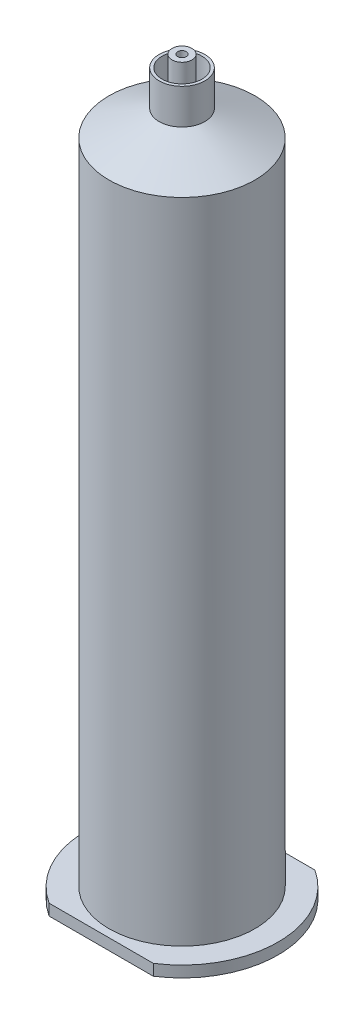
ISO-10303-21;
HEADER;
FILE_DESCRIPTION(('STEP AP214'),'2;1');
FILE_NAME('part.step','',(''),(''),'','','');
FILE_SCHEMA(('AUTOMOTIVE_DESIGN { 1 0 10303 214 1 1 1 1 }'));
ENDSEC;
DATA;
#1=APPLICATION_CONTEXT('core data for automotive mechanical design processes');
#2=APPLICATION_PROTOCOL_DEFINITION('international standard','automotive_design',2000,#1);
#3=PRODUCT_CONTEXT('',#1,'mechanical');
#4=PRODUCT('Part','Part','',(#3));
#5=PRODUCT_RELATED_PRODUCT_CATEGORY('part','',(#4));
#6=PRODUCT_DEFINITION_FORMATION('','',#4);
#7=PRODUCT_DEFINITION_CONTEXT('part definition',#1,'design');
#8=PRODUCT_DEFINITION('design','',#6,#7);
#9=PRODUCT_DEFINITION_SHAPE('','',#8);
#10=(LENGTH_UNIT() NAMED_UNIT(*) SI_UNIT(.MILLI.,.METRE.));
#11=(NAMED_UNIT(*) PLANE_ANGLE_UNIT() SI_UNIT($,.RADIAN.));
#12=(NAMED_UNIT(*) SI_UNIT($,.STERADIAN.) SOLID_ANGLE_UNIT());
#13=UNCERTAINTY_MEASURE_WITH_UNIT(LENGTH_MEASURE(1.E-05),#10,'distance_accuracy_value','');
#14=(GEOMETRIC_REPRESENTATION_CONTEXT(3) GLOBAL_UNCERTAINTY_ASSIGNED_CONTEXT((#13)) GLOBAL_UNIT_ASSIGNED_CONTEXT((#10,
#11,#12)) REPRESENTATION_CONTEXT('',''));
#15=CARTESIAN_POINT('',(0.,0.,0.));
#16=DIRECTION('',(0.,0.,1.));
#17=DIRECTION('',(1.,0.,0.));
#18=AXIS2_PLACEMENT_3D('',#15,#16,#17);
#19=CARTESIAN_POINT('',(0.,148.,0.));
#20=DIRECTION('',(0.,1.,0.));
#21=DIRECTION('',(0.,0.,1.));
#22=AXIS2_PLACEMENT_3D('',#19,#20,#21);
#23=PLANE('',#22);
#24=CARTESIAN_POINT('',(0.,148.,0.));
#25=DIRECTION('',(0.,1.,0.));
#26=DIRECTION('',(0.,0.,1.));
#27=AXIS2_PLACEMENT_3D('',#24,#25,#26);
#28=CIRCLE('',#27,4.7);
#29=CARTESIAN_POINT('',(0.,148.,-4.7));
#30=VERTEX_POINT('',#29);
#31=EDGE_CURVE('E13',#30,#30,#28,.T.);
#32=ORIENTED_EDGE('',*,*,#31,.T.);
#33=EDGE_LOOP('',(#32));
#34=FACE_BOUND('',#33,.T.);
#35=CARTESIAN_POINT('',(0.,148.,0.));
#36=DIRECTION('',(0.,1.,0.));
#37=DIRECTION('',(0.,0.,1.));
#38=AXIS2_PLACEMENT_3D('',#35,#36,#37);
#39=CIRCLE('',#38,4.1);
#40=CARTESIAN_POINT('',(0.,148.,-4.1));
#41=VERTEX_POINT('',#40);
#42=EDGE_CURVE('E69',#41,#41,#39,.T.);
#43=ORIENTED_EDGE('',*,*,#42,.F.);
#44=EDGE_LOOP('',(#43));
#45=FACE_BOUND('',#44,.T.);
#46=ADVANCED_FACE('F58',(#34,#45),#23,.T.);
#47=CARTESIAN_POINT('',(0.,140.75,0.));
#48=DIRECTION('',(0.,1.,0.));
#49=DIRECTION('',(0.,0.,1.));
#50=AXIS2_PLACEMENT_3D('',#47,#48,#49);
#51=PLANE('',#50);
#52=CARTESIAN_POINT('',(0.,140.75,0.));
#53=DIRECTION('',(0.,1.,0.));
#54=DIRECTION('',(0.,0.,1.));
#55=AXIS2_PLACEMENT_3D('',#52,#53,#54);
#56=CIRCLE('',#55,4.7);
#57=CARTESIAN_POINT('',(0.,140.75,-4.7));
#58=VERTEX_POINT('',#57);
#59=EDGE_CURVE('E62',#58,#58,#56,.T.);
#60=ORIENTED_EDGE('',*,*,#59,.F.);
#61=EDGE_LOOP('',(#60));
#62=FACE_BOUND('',#61,.T.);
#63=CARTESIAN_POINT('',(0.,140.75,0.));
#64=DIRECTION('',(0.,1.,0.));
#65=DIRECTION('',(0.,0.,1.));
#66=AXIS2_PLACEMENT_3D('',#63,#64,#65);
#67=CIRCLE('',#66,4.1);
#68=CARTESIAN_POINT('',(0.,140.75,-4.1));
#69=VERTEX_POINT('',#68);
#70=EDGE_CURVE('E71',#69,#69,#67,.T.);
#71=ORIENTED_EDGE('',*,*,#70,.T.);
#72=EDGE_LOOP('',(#71));
#73=FACE_BOUND('',#72,.T.);
#74=ADVANCED_FACE('F81',(#62,#73),#51,.F.);
#75=CARTESIAN_POINT('',(0.,148.,0.));
#76=DIRECTION('',(0.,-1.,0.));
#77=DIRECTION('',(0.,0.,-1.));
#78=AXIS2_PLACEMENT_3D('',#75,#76,#77);
#79=CYLINDRICAL_SURFACE('',#78,4.7);
#80=CARTESIAN_POINT('',(0.,148.,-4.7));
#81=CARTESIAN_POINT('',(0.,147.924479166667,-4.7));
#82=CARTESIAN_POINT('',(0.,147.848958333333,-4.7));
#83=CARTESIAN_POINT('',(0.,147.697916666667,-4.7));
#84=CARTESIAN_POINT('',(0.,147.622395833333,-4.7));
#85=CARTESIAN_POINT('',(0.,147.471354166667,-4.7));
#86=CARTESIAN_POINT('',(0.,147.395833333333,-4.7));
#87=CARTESIAN_POINT('',(0.,147.244791666667,-4.7));
#88=CARTESIAN_POINT('',(0.,147.169270833333,-4.7));
#89=CARTESIAN_POINT('',(0.,147.018229166667,-4.7));
#90=CARTESIAN_POINT('',(0.,146.942708333333,-4.7));
#91=CARTESIAN_POINT('',(0.,146.791666666667,-4.7));
#92=CARTESIAN_POINT('',(0.,146.716145833333,-4.7));
#93=CARTESIAN_POINT('',(0.,146.565104166667,-4.7));
#94=CARTESIAN_POINT('',(0.,146.489583333333,-4.7));
#95=CARTESIAN_POINT('',(0.,146.338541666667,-4.7));
#96=CARTESIAN_POINT('',(0.,146.263020833333,-4.7));
#97=CARTESIAN_POINT('',(0.,146.111979166667,-4.7));
#98=CARTESIAN_POINT('',(0.,146.036458333333,-4.7));
#99=CARTESIAN_POINT('',(0.,145.885416666667,-4.7));
#100=CARTESIAN_POINT('',(0.,145.809895833333,-4.7));
#101=CARTESIAN_POINT('',(0.,145.658854166667,-4.7));
#102=CARTESIAN_POINT('',(0.,145.583333333333,-4.7));
#103=CARTESIAN_POINT('',(0.,145.432291666667,-4.7));
#104=CARTESIAN_POINT('',(0.,145.356770833333,-4.7));
#105=CARTESIAN_POINT('',(0.,145.205729166667,-4.7));
#106=CARTESIAN_POINT('',(0.,145.130208333333,-4.7));
#107=CARTESIAN_POINT('',(0.,144.979166666667,-4.7));
#108=CARTESIAN_POINT('',(0.,144.903645833333,-4.7));
#109=CARTESIAN_POINT('',(0.,144.752604166667,-4.7));
#110=CARTESIAN_POINT('',(0.,144.677083333333,-4.7));
#111=CARTESIAN_POINT('',(0.,144.526041666667,-4.7));
#112=CARTESIAN_POINT('',(0.,144.450520833333,-4.7));
#113=CARTESIAN_POINT('',(0.,144.299479166667,-4.7));
#114=CARTESIAN_POINT('',(0.,144.223958333333,-4.7));
#115=CARTESIAN_POINT('',(0.,144.072916666667,-4.7));
#116=CARTESIAN_POINT('',(0.,143.997395833333,-4.7));
#117=CARTESIAN_POINT('',(0.,143.846354166667,-4.7));
#118=CARTESIAN_POINT('',(0.,143.770833333333,-4.7));
#119=CARTESIAN_POINT('',(0.,143.619791666667,-4.7));
#120=CARTESIAN_POINT('',(0.,143.544270833333,-4.7));
#121=CARTESIAN_POINT('',(0.,143.393229166667,-4.7));
#122=CARTESIAN_POINT('',(0.,143.317708333333,-4.7));
#123=CARTESIAN_POINT('',(0.,143.166666666667,-4.7));
#124=CARTESIAN_POINT('',(0.,143.091145833333,-4.7));
#125=CARTESIAN_POINT('',(0.,142.940104166667,-4.7));
#126=CARTESIAN_POINT('',(0.,142.864583333333,-4.7));
#127=CARTESIAN_POINT('',(0.,142.713541666667,-4.7));
#128=CARTESIAN_POINT('',(0.,142.638020833333,-4.7));
#129=CARTESIAN_POINT('',(0.,142.486979166667,-4.7));
#130=CARTESIAN_POINT('',(0.,142.411458333333,-4.7));
#131=CARTESIAN_POINT('',(0.,142.260416666667,-4.7));
#132=CARTESIAN_POINT('',(0.,142.184895833333,-4.7));
#133=CARTESIAN_POINT('',(0.,142.033854166667,-4.7));
#134=CARTESIAN_POINT('',(0.,141.958333333333,-4.7));
#135=CARTESIAN_POINT('',(0.,141.807291666667,-4.7));
#136=CARTESIAN_POINT('',(0.,141.731770833333,-4.7));
#137=CARTESIAN_POINT('',(0.,141.580729166667,-4.7));
#138=CARTESIAN_POINT('',(0.,141.505208333333,-4.7));
#139=CARTESIAN_POINT('',(0.,141.354166666667,-4.7));
#140=CARTESIAN_POINT('',(0.,141.278645833333,-4.7));
#141=CARTESIAN_POINT('',(0.,141.127604166667,-4.7));
#142=CARTESIAN_POINT('',(0.,141.052083333333,-4.7));
#143=CARTESIAN_POINT('',(0.,140.901041666667,-4.7));
#144=CARTESIAN_POINT('',(0.,140.825520833333,-4.7));
#145=CARTESIAN_POINT('',(0.,140.75,-4.7));
#146=B_SPLINE_CURVE_WITH_KNOTS('',3,(#80,#81,#82,#83,#84,#85,#86,#87,#88,#89,#90,#91,#92,#93,
#94,#95,#96,#97,#98,#99,#100,#101,#102,#103,#104,#105,#106,#107,#108,#109,#110,#111,#112,#113,
#114,#115,#116,#117,#118,#119,#120,#121,#122,#123,#124,#125,#126,#127,#128,#129,#130,#131,#132,
#133,#134,#135,#136,#137,#138,#139,#140,#141,#142,#143,#144,#145),.UNSPECIFIED.,.F.,.F.,(4,2,2,
2,2,2,2,2,2,2,2,2,2,2,2,2,2,2,2,2,2,2,2,2,2,2,2,2,2,2,2,2,4),(0.,0.226562500000027,
0.453125000000026,0.679687500000026,0.906250000000025,1.13281250000002,1.35937500000002,
1.58593750000002,1.81250000000002,2.03906250000002,2.26562500000002,2.49218750000002,
2.71875000000002,2.94531250000002,3.17187500000002,3.39843750000002,3.62500000000002,
3.85156250000002,4.07812500000002,4.30468750000002,4.53125000000001,4.75781250000001,
4.98437500000001,5.21093750000001,5.43750000000001,5.66406250000001,5.89062500000001,
6.11718750000001,6.34375000000001,6.57031250000001,6.79687500000001,7.02343750000001,
7.25000000000001),.UNSPECIFIED.);
#147=EDGE_CURVE('BSEAM60',#30,#58,#146,.T.);
#148=ORIENTED_EDGE('',*,*,#31,.F.);
#149=ORIENTED_EDGE('',*,*,#59,.T.);
#150=ORIENTED_EDGE('',*,*,#147,.T.);
#151=ORIENTED_EDGE('',*,*,#147,.F.);
#152=EDGE_LOOP('',(#148,#150,#149,#151));
#153=FACE_BOUND('',#152,.T.);
#154=ADVANCED_FACE('F60',(#153),#79,.T.);
#155=CARTESIAN_POINT('',(0.,148.,0.));
#156=DIRECTION('',(0.,-1.,0.));
#157=DIRECTION('',(0.,0.,-1.));
#158=AXIS2_PLACEMENT_3D('',#155,#156,#157);
#159=CYLINDRICAL_SURFACE('',#158,4.1);
#160=CARTESIAN_POINT('',(0.,148.,-4.1));
#161=CARTESIAN_POINT('',(0.,147.924479166667,-4.1));
#162=CARTESIAN_POINT('',(0.,147.848958333333,-4.1));
#163=CARTESIAN_POINT('',(0.,147.697916666667,-4.1));
#164=CARTESIAN_POINT('',(0.,147.622395833333,-4.1));
#165=CARTESIAN_POINT('',(0.,147.471354166667,-4.1));
#166=CARTESIAN_POINT('',(0.,147.395833333333,-4.1));
#167=CARTESIAN_POINT('',(0.,147.244791666667,-4.1));
#168=CARTESIAN_POINT('',(0.,147.169270833333,-4.1));
#169=CARTESIAN_POINT('',(0.,147.018229166667,-4.1));
#170=CARTESIAN_POINT('',(0.,146.942708333333,-4.1));
#171=CARTESIAN_POINT('',(0.,146.791666666667,-4.1));
#172=CARTESIAN_POINT('',(0.,146.716145833333,-4.1));
#173=CARTESIAN_POINT('',(0.,146.565104166667,-4.1));
#174=CARTESIAN_POINT('',(0.,146.489583333333,-4.1));
#175=CARTESIAN_POINT('',(0.,146.338541666667,-4.1));
#176=CARTESIAN_POINT('',(0.,146.263020833333,-4.1));
#177=CARTESIAN_POINT('',(0.,146.111979166667,-4.1));
#178=CARTESIAN_POINT('',(0.,146.036458333333,-4.1));
#179=CARTESIAN_POINT('',(0.,145.885416666667,-4.1));
#180=CARTESIAN_POINT('',(0.,145.809895833333,-4.1));
#181=CARTESIAN_POINT('',(0.,145.658854166667,-4.1));
#182=CARTESIAN_POINT('',(0.,145.583333333333,-4.1));
#183=CARTESIAN_POINT('',(0.,145.432291666667,-4.1));
#184=CARTESIAN_POINT('',(0.,145.356770833333,-4.1));
#185=CARTESIAN_POINT('',(0.,145.205729166667,-4.1));
#186=CARTESIAN_POINT('',(0.,145.130208333333,-4.1));
#187=CARTESIAN_POINT('',(0.,144.979166666667,-4.1));
#188=CARTESIAN_POINT('',(0.,144.903645833333,-4.1));
#189=CARTESIAN_POINT('',(0.,144.752604166667,-4.1));
#190=CARTESIAN_POINT('',(0.,144.677083333333,-4.1));
#191=CARTESIAN_POINT('',(0.,144.526041666667,-4.1));
#192=CARTESIAN_POINT('',(0.,144.450520833333,-4.1));
#193=CARTESIAN_POINT('',(0.,144.299479166667,-4.1));
#194=CARTESIAN_POINT('',(0.,144.223958333333,-4.1));
#195=CARTESIAN_POINT('',(0.,144.072916666667,-4.1));
#196=CARTESIAN_POINT('',(0.,143.997395833333,-4.1));
#197=CARTESIAN_POINT('',(0.,143.846354166667,-4.1));
#198=CARTESIAN_POINT('',(0.,143.770833333333,-4.1));
#199=CARTESIAN_POINT('',(0.,143.619791666667,-4.1));
#200=CARTESIAN_POINT('',(0.,143.544270833333,-4.1));
#201=CARTESIAN_POINT('',(0.,143.393229166667,-4.1));
#202=CARTESIAN_POINT('',(0.,143.317708333333,-4.1));
#203=CARTESIAN_POINT('',(0.,143.166666666667,-4.1));
#204=CARTESIAN_POINT('',(0.,143.091145833333,-4.1));
#205=CARTESIAN_POINT('',(0.,142.940104166667,-4.1));
#206=CARTESIAN_POINT('',(0.,142.864583333333,-4.1));
#207=CARTESIAN_POINT('',(0.,142.713541666667,-4.1));
#208=CARTESIAN_POINT('',(0.,142.638020833333,-4.1));
#209=CARTESIAN_POINT('',(0.,142.486979166667,-4.1));
#210=CARTESIAN_POINT('',(0.,142.411458333333,-4.1));
#211=CARTESIAN_POINT('',(0.,142.260416666667,-4.1));
#212=CARTESIAN_POINT('',(0.,142.184895833333,-4.1));
#213=CARTESIAN_POINT('',(0.,142.033854166667,-4.1));
#214=CARTESIAN_POINT('',(0.,141.958333333333,-4.1));
#215=CARTESIAN_POINT('',(0.,141.807291666667,-4.1));
#216=CARTESIAN_POINT('',(0.,141.731770833333,-4.1));
#217=CARTESIAN_POINT('',(0.,141.580729166667,-4.1));
#218=CARTESIAN_POINT('',(0.,141.505208333333,-4.1));
#219=CARTESIAN_POINT('',(0.,141.354166666667,-4.1));
#220=CARTESIAN_POINT('',(0.,141.278645833333,-4.1));
#221=CARTESIAN_POINT('',(0.,141.127604166667,-4.1));
#222=CARTESIAN_POINT('',(0.,141.052083333333,-4.1));
#223=CARTESIAN_POINT('',(0.,140.901041666667,-4.1));
#224=CARTESIAN_POINT('',(0.,140.825520833333,-4.1));
#225=CARTESIAN_POINT('',(0.,140.75,-4.1));
#226=B_SPLINE_CURVE_WITH_KNOTS('',3,(#160,#161,#162,#163,#164,#165,#166,#167,#168,#169,#170,
#171,#172,#173,#174,#175,#176,#177,#178,#179,#180,#181,#182,#183,#184,#185,#186,#187,#188,#189,
#190,#191,#192,#193,#194,#195,#196,#197,#198,#199,#200,#201,#202,#203,#204,#205,#206,#207,#208,
#209,#210,#211,#212,#213,#214,#215,#216,#217,#218,#219,#220,#221,#222,#223,#224,#225),
.UNSPECIFIED.,.F.,.F.,(4,2,2,2,2,2,2,2,2,2,2,2,2,2,2,2,2,2,2,2,2,2,2,2,2,2,2,2,2,2,2,2,4),(0.,
0.226562499999999,0.453124999999999,0.679687499999998,0.906249999999997,1.1328125,1.359375,
1.5859375,1.81249999999999,2.03906249999999,2.26562499999999,2.49218749999999,2.71874999999999,
2.94531249999999,3.17187499999999,3.39843749999999,3.62499999999999,3.85156249999999,
4.07812499999999,4.30468749999999,4.53124999999999,4.75781249999999,4.98437499999999,
5.21093749999998,5.43749999999998,5.66406249999998,5.89062499999998,6.11718749999998,
6.34374999999998,6.57031249999998,6.79687499999998,7.02343749999998,7.24999999999998),.UNSPECIFIED.);
#227=EDGE_CURVE('BSEAM77',#41,#69,#226,.T.);
#228=ORIENTED_EDGE('',*,*,#42,.T.);
#229=ORIENTED_EDGE('',*,*,#70,.F.);
#230=ORIENTED_EDGE('',*,*,#227,.T.);
#231=ORIENTED_EDGE('',*,*,#227,.F.);
#232=EDGE_LOOP('',(#228,#230,#229,#231));
#233=FACE_BOUND('',#232,.T.);
#234=ADVANCED_FACE('F77',(#233),#159,.F.);
#235=CLOSED_SHELL('',(#46,#74,#154,#234));
#236=MANIFOLD_SOLID_BREP('B2',#235);
#237=CARTESIAN_POINT('',(0.,1.3,0.));
#238=DIRECTION('',(0.,-1.,0.));
#239=DIRECTION('',(0.,0.,-1.));
#240=AXIS2_PLACEMENT_3D('',#237,#238,#239);
#241=CYLINDRICAL_SURFACE('',#240,19.75);
#242=CARTESIAN_POINT('',(0.,0.,0.));
#243=DIRECTION('',(0.,1.,0.));
#244=DIRECTION('',(0.,0.,1.));
#245=AXIS2_PLACEMENT_3D('',#242,#243,#244);
#246=CIRCLE('',#245,19.75);
#247=CARTESIAN_POINT('',(10.7005840962071,0.,16.6));
#248=VERTEX_POINT('',#247);
#249=CARTESIAN_POINT('',(10.7005840962071,0.,-16.6));
#250=VERTEX_POINT('',#249);
#251=EDGE_CURVE('E175',#248,#250,#246,.T.);
#252=ORIENTED_EDGE('',*,*,#251,.T.);
#253=DIRECTION('',(0.,-1.,0.));
#254=VECTOR('',#253,1.);
#255=CARTESIAN_POINT('',(10.7005840962071,1.3,-16.6));
#256=LINE('',#255,#254);
#257=CARTESIAN_POINT('',(10.7005840962071,2.3,-16.6));
#258=VERTEX_POINT('',#257);
#259=EDGE_CURVE('E135',#258,#250,#256,.T.);
#260=ORIENTED_EDGE('',*,*,#259,.F.);
#261=CARTESIAN_POINT('',(0.,2.3,0.));
#262=DIRECTION('',(0.,1.,0.));
#263=DIRECTION('',(0.,0.,1.));
#264=AXIS2_PLACEMENT_3D('',#261,#262,#263);
#265=CIRCLE('',#264,19.75);
#266=CARTESIAN_POINT('',(10.7005840962071,2.3,16.6));
#267=VERTEX_POINT('',#266);
#268=EDGE_CURVE('E173',#267,#258,#265,.T.);
#269=ORIENTED_EDGE('',*,*,#268,.F.);
#270=DIRECTION('',(0.,-1.,0.));
#271=VECTOR('',#270,1.);
#272=CARTESIAN_POINT('',(10.7005840962071,1.3,16.6));
#273=LINE('',#272,#271);
#274=EDGE_CURVE('E205',#267,#248,#273,.T.);
#275=ORIENTED_EDGE('',*,*,#274,.T.);
#276=EDGE_LOOP('',(#252,#260,#269,#275));
#277=FACE_BOUND('',#276,.T.);
#278=ADVANCED_FACE('F125',(#277),#241,.T.);
#279=CARTESIAN_POINT('',(-10.7005840962071,1.3,-16.6));
#280=DIRECTION('',(0.,0.,1.));
#281=DIRECTION('',(1.,0.,0.));
#282=AXIS2_PLACEMENT_3D('',#279,#280,#281);
#283=PLANE('',#282);
#284=DIRECTION('',(-1.,0.,0.));
#285=VECTOR('',#284,1.);
#286=CARTESIAN_POINT('',(-10.7005840962071,0.,-16.6));
#287=LINE('',#286,#285);
#288=CARTESIAN_POINT('',(-10.7005840962071,0.,-16.6));
#289=VERTEX_POINT('',#288);
#290=EDGE_CURVE('E201',#250,#289,#287,.T.);
#291=ORIENTED_EDGE('',*,*,#290,.T.);
#292=DIRECTION('',(0.,-1.,0.));
#293=VECTOR('',#292,1.);
#294=CARTESIAN_POINT('',(-10.7005840962071,1.3,-16.6));
#295=LINE('',#294,#293);
#296=CARTESIAN_POINT('',(-10.7005840962071,2.3,-16.6));
#297=VERTEX_POINT('',#296);
#298=EDGE_CURVE('E177',#297,#289,#295,.T.);
#299=ORIENTED_EDGE('',*,*,#298,.F.);
#300=DIRECTION('',(-1.,0.,0.));
#301=VECTOR('',#300,1.);
#302=CARTESIAN_POINT('',(10.7005840962071,2.3,-16.6));
#303=LINE('',#302,#301);
#304=EDGE_CURVE('E180',#258,#297,#303,.T.);
#305=ORIENTED_EDGE('',*,*,#304,.F.);
#306=ORIENTED_EDGE('',*,*,#259,.T.);
#307=EDGE_LOOP('',(#291,#299,#305,#306));
#308=FACE_BOUND('',#307,.T.);
#309=ADVANCED_FACE('F181',(#308),#283,.F.);
#310=CARTESIAN_POINT('',(0.,1.3,0.));
#311=DIRECTION('',(0.,-1.,0.));
#312=DIRECTION('',(0.,0.,-1.));
#313=AXIS2_PLACEMENT_3D('',#310,#311,#312);
#314=CYLINDRICAL_SURFACE('',#313,19.75);
#315=CARTESIAN_POINT('',(0.,0.,0.));
#316=DIRECTION('',(0.,1.,0.));
#317=DIRECTION('',(0.,0.,1.));
#318=AXIS2_PLACEMENT_3D('',#315,#316,#317);
#319=CIRCLE('',#318,19.75);
#320=CARTESIAN_POINT('',(-10.7005840962071,0.,16.6));
#321=VERTEX_POINT('',#320);
#322=EDGE_CURVE('E151',#289,#321,#319,.T.);
#323=ORIENTED_EDGE('',*,*,#322,.T.);
#324=DIRECTION('',(0.,-1.,0.));
#325=VECTOR('',#324,1.);
#326=CARTESIAN_POINT('',(-10.7005840962071,1.3,16.6));
#327=LINE('',#326,#325);
#328=CARTESIAN_POINT('',(-10.7005840962071,2.3,16.6));
#329=VERTEX_POINT('',#328);
#330=EDGE_CURVE('E207',#329,#321,#327,.T.);
#331=ORIENTED_EDGE('',*,*,#330,.F.);
#332=CARTESIAN_POINT('',(0.,2.3,0.));
#333=DIRECTION('',(0.,1.,0.));
#334=DIRECTION('',(0.,0.,1.));
#335=AXIS2_PLACEMENT_3D('',#332,#333,#334);
#336=CIRCLE('',#335,19.75);
#337=EDGE_CURVE('E185',#297,#329,#336,.T.);
#338=ORIENTED_EDGE('',*,*,#337,.F.);
#339=ORIENTED_EDGE('',*,*,#298,.T.);
#340=EDGE_LOOP('',(#323,#331,#338,#339));
#341=FACE_BOUND('',#340,.T.);
#342=ADVANCED_FACE('F250',(#341),#314,.T.);
#343=CARTESIAN_POINT('',(-10.7005840962071,1.3,16.6));
#344=DIRECTION('',(0.,0.,-1.));
#345=DIRECTION('',(-1.,0.,0.));
#346=AXIS2_PLACEMENT_3D('',#343,#344,#345);
#347=PLANE('',#346);
#348=DIRECTION('',(1.,0.,0.));
#349=VECTOR('',#348,1.);
#350=CARTESIAN_POINT('',(-10.7005840962071,0.,16.6));
#351=LINE('',#350,#349);
#352=EDGE_CURVE('E143',#321,#248,#351,.T.);
#353=ORIENTED_EDGE('',*,*,#352,.T.);
#354=ORIENTED_EDGE('',*,*,#274,.F.);
#355=DIRECTION('',(1.,0.,0.));
#356=VECTOR('',#355,1.);
#357=CARTESIAN_POINT('',(-10.7005840962071,2.3,16.6));
#358=LINE('',#357,#356);
#359=EDGE_CURVE('E190',#329,#267,#358,.T.);
#360=ORIENTED_EDGE('',*,*,#359,.F.);
#361=ORIENTED_EDGE('',*,*,#330,.T.);
#362=EDGE_LOOP('',(#353,#354,#360,#361));
#363=FACE_BOUND('',#362,.T.);
#364=ADVANCED_FACE('F246',(#363),#347,.F.);
#365=CARTESIAN_POINT('',(0.,0.,0.));
#366=DIRECTION('',(0.,1.,0.));
#367=DIRECTION('',(0.,0.,1.));
#368=AXIS2_PLACEMENT_3D('',#365,#366,#367);
#369=PLANE('',#368);
#370=CARTESIAN_POINT('',(0.,0.,0.));
#371=DIRECTION('',(0.,-1.,0.));
#372=DIRECTION('',(0.,0.,-1.));
#373=AXIS2_PLACEMENT_3D('',#370,#371,#372);
#374=CIRCLE('',#373,13.75);
#375=CARTESIAN_POINT('',(0.,0.,-13.75));
#376=VERTEX_POINT('',#375);
#377=EDGE_CURVE('E191',#376,#376,#374,.T.);
#378=ORIENTED_EDGE('',*,*,#377,.F.);
#379=EDGE_LOOP('',(#378));
#380=FACE_BOUND('',#379,.T.);
#381=ORIENTED_EDGE('',*,*,#251,.F.);
#382=ORIENTED_EDGE('',*,*,#352,.F.);
#383=ORIENTED_EDGE('',*,*,#322,.F.);
#384=ORIENTED_EDGE('',*,*,#290,.F.);
#385=EDGE_LOOP('',(#381,#382,#383,#384));
#386=FACE_BOUND('',#385,.T.);
#387=ADVANCED_FACE('F242',(#380,#386),#369,.F.);
#388=CARTESIAN_POINT('',(0.,2.3,0.));
#389=DIRECTION('',(0.,1.,0.));
#390=DIRECTION('',(0.,0.,1.));
#391=AXIS2_PLACEMENT_3D('',#388,#389,#390);
#392=PLANE('',#391);
#393=CARTESIAN_POINT('',(0.,2.3,0.));
#394=DIRECTION('',(0.,1.,0.));
#395=DIRECTION('',(0.,0.,1.));
#396=AXIS2_PLACEMENT_3D('',#393,#394,#395);
#397=CIRCLE('',#396,15.);
#398=CARTESIAN_POINT('',(0.,2.3,15.));
#399=VERTEX_POINT('',#398);
#400=EDGE_CURVE('E56',#399,#399,#397,.T.);
#401=ORIENTED_EDGE('',*,*,#400,.F.);
#402=EDGE_LOOP('',(#401));
#403=FACE_BOUND('',#402,.T.);
#404=ORIENTED_EDGE('',*,*,#268,.T.);
#405=ORIENTED_EDGE('',*,*,#304,.T.);
#406=ORIENTED_EDGE('',*,*,#337,.T.);
#407=ORIENTED_EDGE('',*,*,#359,.T.);
#408=EDGE_LOOP('',(#404,#405,#406,#407));
#409=FACE_BOUND('',#408,.T.);
#410=ADVANCED_FACE('F188',(#403,#409),#392,.T.);
#411=CARTESIAN_POINT('',(0.,135.5,0.));
#412=DIRECTION('',(0.,-1.,0.));
#413=DIRECTION('',(0.,0.,-1.));
#414=AXIS2_PLACEMENT_3D('',#411,#412,#413);
#415=CYLINDRICAL_SURFACE('',#414,15.);
#416=ORIENTED_EDGE('',*,*,#400,.T.);
#417=EDGE_LOOP('',(#416));
#418=FACE_BOUND('',#417,.T.);
#419=CARTESIAN_POINT('',(0.,135.5,0.));
#420=DIRECTION('',(0.,1.,0.));
#421=DIRECTION('',(0.,0.,1.));
#422=AXIS2_PLACEMENT_3D('',#419,#420,#421);
#423=CIRCLE('',#422,15.);
#424=CARTESIAN_POINT('',(-13.8291643866573,135.5,5.80983755081055));
#425=VERTEX_POINT('',#424);
#426=EDGE_CURVE('E194',#425,#425,#423,.T.);
#427=ORIENTED_EDGE('',*,*,#426,.F.);
#428=EDGE_LOOP('',(#427));
#429=FACE_BOUND('',#428,.T.);
#430=ADVANCED_FACE('F232',(#418,#429),#415,.T.);
#431=CARTESIAN_POINT('',(0.,135.5,0.));
#432=DIRECTION('',(0.,-1.,0.));
#433=DIRECTION('',(0.,0.,-1.));
#434=AXIS2_PLACEMENT_3D('',#431,#432,#433);
#435=CYLINDRICAL_SURFACE('',#434,13.75);
#436=CARTESIAN_POINT('',(0.,135.5,0.));
#437=DIRECTION('',(0.,1.,0.));
#438=DIRECTION('',(0.,0.,1.));
#439=AXIS2_PLACEMENT_3D('',#436,#437,#438);
#440=CIRCLE('',#439,13.75);
#441=CARTESIAN_POINT('',(0.,135.5,13.75));
#442=VERTEX_POINT('',#441);
#443=EDGE_CURVE('E214',#442,#442,#440,.T.);
#444=ORIENTED_EDGE('',*,*,#443,.T.);
#445=EDGE_LOOP('',(#444));
#446=FACE_BOUND('',#445,.T.);
#447=ORIENTED_EDGE('',*,*,#377,.T.);
#448=EDGE_LOOP('',(#447));
#449=FACE_BOUND('',#448,.T.);
#450=ADVANCED_FACE('F221',(#446,#449),#435,.F.);
#451=CARTESIAN_POINT('',(-0.960394266770218,141.5,1.81111646570697));
#452=CARTESIAN_POINT('',(-13.8291643866573,135.5,5.80983755081055));
#453=CARTESIAN_POINT('',(-4.58262719818415,141.5,-0.10967206783347));
#454=CARTESIAN_POINT('',(-25.4488394882784,135.5,-21.8484912225041));
#455=CARTESIAN_POINT('',(-2.66183866464371,141.5,-3.7319049992474));
#456=CARTESIAN_POINT('',(2.20948928503624,135.5,-33.4681663241252));
#457=CARTESIAN_POINT('',(0.960394266770218,141.5,-1.81111646570697));
#458=CARTESIAN_POINT('',(13.8291643866573,135.5,-5.80983755081055));
#459=CARTESIAN_POINT('',(4.58262719818415,141.5,0.109672067833468));
#460=CARTESIAN_POINT('',(25.4488394882784,135.5,21.8484912225041));
#461=CARTESIAN_POINT('',(2.66183866464371,141.5,3.7319049992474));
#462=CARTESIAN_POINT('',(-2.20948928503624,135.5,33.4681663241252));
#463=CARTESIAN_POINT('',(-0.960394266770218,141.5,1.81111646570697));
#464=CARTESIAN_POINT('',(-13.8291643866573,135.5,5.80983755081055));
#465=(BOUNDED_SURFACE() B_SPLINE_SURFACE(3,1,((#451,#452),(#453,#454),(#455,#456),(#457,#458),
(#459,#460),(#461,#462),(#463,#464)),.UNSPECIFIED.,.T.,.F.,.F.) B_SPLINE_SURFACE_WITH_KNOTS((4,
3,4),(2,2),(0.,0.5,1.),(0.,1.),
.UNSPECIFIED.) GEOMETRIC_REPRESENTATION_ITEM() RATIONAL_B_SPLINE_SURFACE(((1.,1.),
(0.333333333333333,0.333333333333333),(0.333333333333333,0.333333333333333),(1.,1.),
(0.333333333333334,0.333333333333333),(0.333333333333334,0.333333333333333),(1.,1.))) REPRESENTATION_ITEM('') SURFACE());
#466=CARTESIAN_POINT('',(0.,141.5,0.));
#467=DIRECTION('',(0.,1.,0.));
#468=DIRECTION('',(0.,0.,1.));
#469=AXIS2_PLACEMENT_3D('',#466,#467,#468);
#470=CIRCLE('',#469,2.05);
#471=CARTESIAN_POINT('',(-0.960394266770218,141.5,1.81111646570697));
#472=VERTEX_POINT('',#471);
#473=EDGE_CURVE('E362',#472,#472,#470,.T.);
#474=CARTESIAN_POINT('',(-0.960394266770218,141.5,1.81111646570697));
#475=CARTESIAN_POINT('',(-1.09444395551905,141.4375,1.85276981034347));
#476=CARTESIAN_POINT('',(-1.22849364426787,141.375,1.89442315497996));
#477=CARTESIAN_POINT('',(-1.49659302176552,141.25,1.97772984425295));
#478=CARTESIAN_POINT('',(-1.63064271051434,141.1875,2.01938318888944));
#479=CARTESIAN_POINT('',(-1.89874208801198,141.0625,2.10268987816243));
#480=CARTESIAN_POINT('',(-2.03279177676081,141.,2.14434322279893));
#481=CARTESIAN_POINT('',(-2.30089115425846,140.875,2.22764991207192));
#482=CARTESIAN_POINT('',(-2.43494084300728,140.8125,2.26930325670842));
#483=CARTESIAN_POINT('',(-2.70304022050493,140.6875,2.35260994598141));
#484=CARTESIAN_POINT('',(-2.83708990925376,140.625,2.39426329061791));
#485=CARTESIAN_POINT('',(-3.1051892867514,140.5,2.4775699798909));
#486=CARTESIAN_POINT('',(-3.23923897550023,140.4375,2.51922332452739));
#487=CARTESIAN_POINT('',(-3.50733835299788,140.3125,2.60253001380038));
#488=CARTESIAN_POINT('',(-3.6413880417467,140.25,2.64418335843688));
#489=CARTESIAN_POINT('',(-3.90948741924435,140.125,2.72749004770987));
#490=CARTESIAN_POINT('',(-4.04353710799318,140.0625,2.76914339234637));
#491=CARTESIAN_POINT('',(-4.31163648549082,139.9375,2.85245008161936));
#492=CARTESIAN_POINT('',(-4.44568617423965,139.875,2.89410342625585));
#493=CARTESIAN_POINT('',(-4.71378555173729,139.75,2.97741011552884));
#494=CARTESIAN_POINT('',(-4.84783524048612,139.6875,3.01906346016534));
#495=CARTESIAN_POINT('',(-5.11593461798377,139.5625,3.10237014943833));
#496=CARTESIAN_POINT('',(-5.24998430673259,139.5,3.14402349407483));
#497=CARTESIAN_POINT('',(-5.51808368423024,139.375,3.22733018334782));
#498=CARTESIAN_POINT('',(-5.65213337297907,139.3125,3.26898352798431));
#499=CARTESIAN_POINT('',(-5.92023275047671,139.1875,3.3522902172573));
#500=CARTESIAN_POINT('',(-6.05428243922553,139.125,3.3939435618938));
#501=CARTESIAN_POINT('',(-6.32238181672319,139.,3.47725025116679));
#502=CARTESIAN_POINT('',(-6.45643150547201,138.9375,3.51890359580329));
#503=CARTESIAN_POINT('',(-6.72453088296966,138.8125,3.60221028507628));
#504=CARTESIAN_POINT('',(-6.85858057171848,138.75,3.64386362971277));
#505=CARTESIAN_POINT('',(-7.12667994921613,138.625,3.72717031898577));
#506=CARTESIAN_POINT('',(-7.26072963796496,138.5625,3.76882366362226));
#507=CARTESIAN_POINT('',(-7.5288290154626,138.4375,3.85213035289525));
#508=CARTESIAN_POINT('',(-7.66287870421143,138.375,3.89378369753175));
#509=CARTESIAN_POINT('',(-7.93097808170908,138.25,3.97709038680474));
#510=CARTESIAN_POINT('',(-8.0650277704579,138.1875,4.01874373144124));
#511=CARTESIAN_POINT('',(-8.33312714795555,138.0625,4.10205042071423));
#512=CARTESIAN_POINT('',(-8.46717683670437,138.,4.14370376535072));
#513=CARTESIAN_POINT('',(-8.73527621420202,137.875,4.22701045462371));
#514=CARTESIAN_POINT('',(-8.86932590295084,137.8125,4.26866379926021));
#515=CARTESIAN_POINT('',(-9.1374252804485,137.6875,4.3519704885332));
#516=CARTESIAN_POINT('',(-9.27147496919732,137.625,4.3936238331697));
#517=CARTESIAN_POINT('',(-9.53957434669497,137.5,4.47693052244269));
#518=CARTESIAN_POINT('',(-9.67362403544379,137.4375,4.51858386707918));
#519=CARTESIAN_POINT('',(-9.94172341294144,137.3125,4.60189055635217));
#520=CARTESIAN_POINT('',(-10.0757731016903,137.25,4.64354390098867));
#521=CARTESIAN_POINT('',(-10.3438724791879,137.125,4.72685059026166));
#522=CARTESIAN_POINT('',(-10.4779221679367,137.0625,4.76850393489816));
#523=CARTESIAN_POINT('',(-10.7460215454344,136.9375,4.85181062417115));
#524=CARTESIAN_POINT('',(-10.8800712341832,136.875,4.89346396880764));
#525=CARTESIAN_POINT('',(-11.1481706116809,136.75,4.97677065808064));
#526=CARTESIAN_POINT('',(-11.2822203004297,136.6875,5.01842400271713));
#527=CARTESIAN_POINT('',(-11.5503196779273,136.5625,5.10173069199012));
#528=CARTESIAN_POINT('',(-11.6843693666761,136.5,5.14338403662662));
#529=CARTESIAN_POINT('',(-11.9524687441738,136.375,5.22669072589961));
#530=CARTESIAN_POINT('',(-12.0865184329226,136.3125,5.26834407053611));
#531=CARTESIAN_POINT('',(-12.3546178104203,136.1875,5.3516507598091));
#532=CARTESIAN_POINT('',(-12.4886674991691,136.125,5.39330410444559));
#533=CARTESIAN_POINT('',(-12.7567668766667,136.,5.47661079371858));
#534=CARTESIAN_POINT('',(-12.8908165654156,135.9375,5.51826413835508));
#535=CARTESIAN_POINT('',(-13.1589159429132,135.8125,5.60157082762807));
#536=CARTESIAN_POINT('',(-13.292965631662,135.75,5.64322417226457));
#537=CARTESIAN_POINT('',(-13.5610650091597,135.625,5.72653086153756));
#538=CARTESIAN_POINT('',(-13.6951146979085,135.5625,5.76818420617405));
#539=CARTESIAN_POINT('',(-13.8291643866573,135.5,5.80983755081055));
#540=B_SPLINE_CURVE_WITH_KNOTS('',3,(#474,#475,#476,#477,#478,#479,#480,#481,#482,#483,#484,
#485,#486,#487,#488,#489,#490,#491,#492,#493,#494,#495,#496,#497,#498,#499,#500,#501,#502,#503,
#504,#505,#506,#507,#508,#509,#510,#511,#512,#513,#514,#515,#516,#517,#518,#519,#520,#521,#522,
#523,#524,#525,#526,#527,#528,#529,#530,#531,#532,#533,#534,#535,#536,#537,#538,#539),
.UNSPECIFIED.,.F.,.F.,(4,2,2,2,2,2,2,2,2,2,2,2,2,2,2,2,2,2,2,2,2,2,2,2,2,2,2,2,2,2,2,2,4),(0.,
0.460971942267165,0.921943884534352,1.38291582680152,1.84388776906869,2.30485971133587,
2.76583165360304,3.22680359587021,3.68777553813738,4.14874748040456,4.60971942267174,
5.0706913649389,5.53166330720608,5.99263524947325,6.45360719174042,6.91457913400759,
7.37555107627477,7.83652301854195,8.29749496080912,8.7584669030763,9.21943884534346,
9.68041078761063,10.1413827298778,10.602354672145,11.0633266144122,11.5242985566793,
11.9852704989465,12.4462424412137,12.9072143834809,13.368186325748,13.8291582680152,
14.2901302102824,14.7511021525495),.UNSPECIFIED.);
#541=EDGE_CURVE('BSEAM231',#472,#425,#540,.T.);
#542=ORIENTED_EDGE('',*,*,#473,.F.);
#543=ORIENTED_EDGE('',*,*,#426,.T.);
#544=ORIENTED_EDGE('',*,*,#541,.T.);
#545=ORIENTED_EDGE('',*,*,#541,.F.);
#546=EDGE_LOOP('',(#542,#544,#543,#545));
#547=FACE_BOUND('',#546,.T.);
#548=ADVANCED_FACE('F231',(#547),#465,.T.);
#549=CARTESIAN_POINT('',(0.,141.5,0.));
#550=DIRECTION('',(0.,-1.,0.));
#551=DIRECTION('',(0.,0.,-1.));
#552=AXIS2_PLACEMENT_3D('',#549,#550,#551);
#553=CONICAL_SURFACE('',#552,0.9,1.13395617443931);
#554=ORIENTED_EDGE('',*,*,#443,.F.);
#555=EDGE_LOOP('',(#554));
#556=FACE_BOUND('',#555,.T.);
#557=CARTESIAN_POINT('',(0.,141.5,0.));
#558=DIRECTION('',(0.,1.,0.));
#559=DIRECTION('',(0.,0.,-1.));
#560=AXIS2_PLACEMENT_3D('',#557,#558,#559);
#561=CIRCLE('',#560,0.9);
#562=CARTESIAN_POINT('',(0.,141.5,-0.9));
#563=VERTEX_POINT('',#562);
#564=EDGE_CURVE('E398',#563,#563,#561,.T.);
#565=ORIENTED_EDGE('',*,*,#564,.T.);
#566=EDGE_LOOP('',(#565));
#567=FACE_BOUND('',#566,.T.);
#568=ADVANCED_FACE('F311',(#556,#567),#553,.F.);
#569=CARTESIAN_POINT('',(0.,158.59827560573,0.));
#570=DIRECTION('',(0.,-1.,0.));
#571=DIRECTION('',(0.,0.,-1.));
#572=AXIS2_PLACEMENT_3D('',#569,#570,#571);
#573=CYLINDRICAL_SURFACE('',#572,2.05);
#574=ORIENTED_EDGE('',*,*,#473,.T.);
#575=EDGE_LOOP('',(#574));
#576=FACE_BOUND('',#575,.T.);
#577=CARTESIAN_POINT('',(0.,150.4,0.));
#578=DIRECTION('',(0.,1.,0.));
#579=DIRECTION('',(0.,0.,1.));
#580=AXIS2_PLACEMENT_3D('',#577,#578,#579);
#581=CIRCLE('',#580,2.05);
#582=CARTESIAN_POINT('',(0.,150.4,2.05));
#583=VERTEX_POINT('',#582);
#584=EDGE_CURVE('E411',#583,#583,#581,.T.);
#585=ORIENTED_EDGE('',*,*,#584,.F.);
#586=EDGE_LOOP('',(#585));
#587=FACE_BOUND('',#586,.T.);
#588=ADVANCED_FACE('F320',(#576,#587),#573,.T.);
#589=CARTESIAN_POINT('',(0.,158.59827560573,0.));
#590=DIRECTION('',(0.,-1.,0.));
#591=DIRECTION('',(0.,0.,-1.));
#592=AXIS2_PLACEMENT_3D('',#589,#590,#591);
#593=CYLINDRICAL_SURFACE('',#592,0.9);
#594=ORIENTED_EDGE('',*,*,#564,.F.);
#595=EDGE_LOOP('',(#594));
#596=FACE_BOUND('',#595,.T.);
#597=CARTESIAN_POINT('',(0.,150.4,0.));
#598=DIRECTION('',(0.,1.,0.));
#599=DIRECTION('',(0.,0.,1.));
#600=AXIS2_PLACEMENT_3D('',#597,#598,#599);
#601=CIRCLE('',#600,0.9);
#602=CARTESIAN_POINT('',(0.,150.4,0.9));
#603=VERTEX_POINT('',#602);
#604=EDGE_CURVE('E408',#603,#603,#601,.T.);
#605=ORIENTED_EDGE('',*,*,#604,.T.);
#606=EDGE_LOOP('',(#605));
#607=FACE_BOUND('',#606,.T.);
#608=ADVANCED_FACE('F329',(#596,#607),#593,.F.);
#609=CARTESIAN_POINT('',(0.,150.4,0.));
#610=DIRECTION('',(0.,1.,0.));
#611=DIRECTION('',(0.,0.,1.));
#612=AXIS2_PLACEMENT_3D('',#609,#610,#611);
#613=PLANE('',#612);
#614=ORIENTED_EDGE('',*,*,#604,.F.);
#615=EDGE_LOOP('',(#614));
#616=FACE_BOUND('',#615,.T.);
#617=ORIENTED_EDGE('',*,*,#584,.T.);
#618=EDGE_LOOP('',(#617));
#619=FACE_BOUND('',#618,.T.);
#620=ADVANCED_FACE('F339',(#616,#619),#613,.T.);
#621=CLOSED_SHELL('',(#278,#309,#342,#364,#387,#410,#430,#450,#548,#568,#588,#608,#620));
#622=MANIFOLD_SOLID_BREP('B8',#621);
#623=ADVANCED_BREP_SHAPE_REPRESENTATION('',(#18,#236,#622),#14);
#624=SHAPE_DEFINITION_REPRESENTATION(#9,#623);
ENDSEC;
END-ISO-10303-21;
